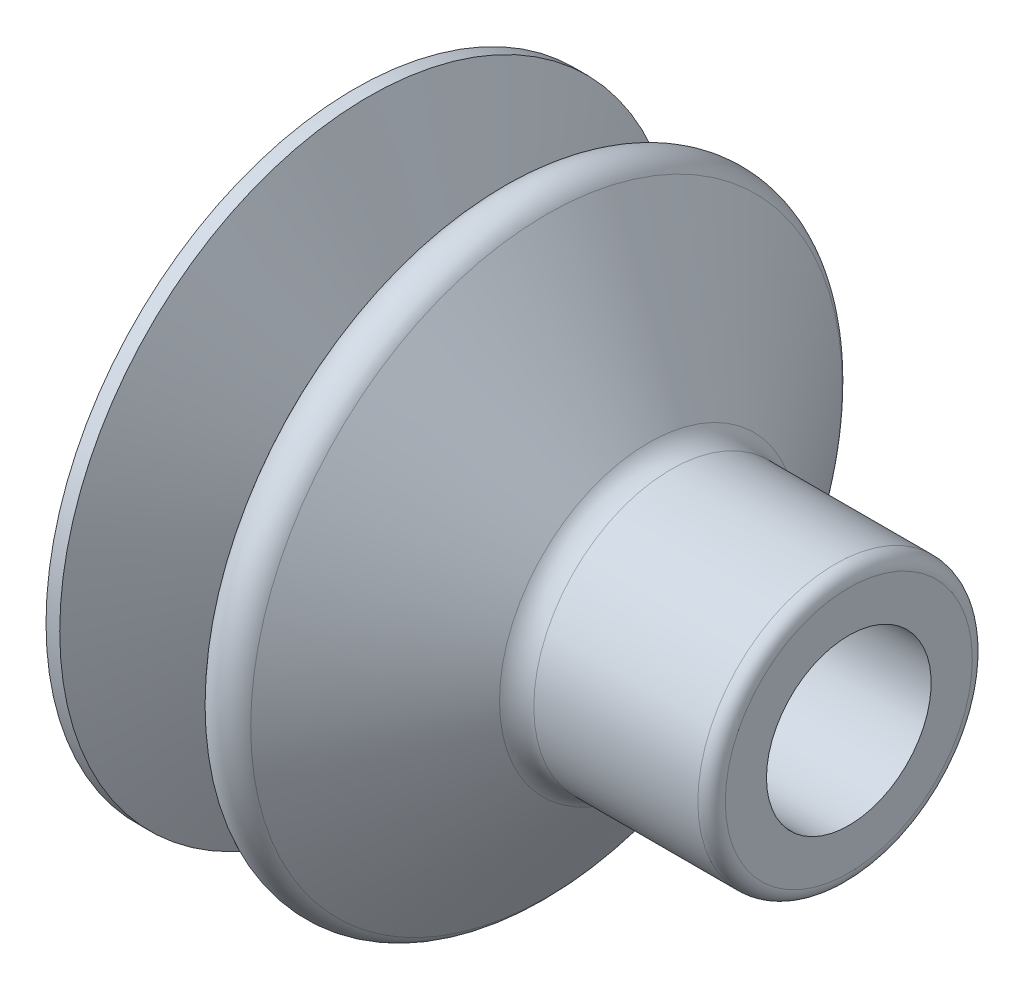
ISO-10303-21;
HEADER;
FILE_DESCRIPTION(('STEP AP214'),'2;1');
FILE_NAME('part.step','',(''),(''),'','','');
FILE_SCHEMA(('AUTOMOTIVE_DESIGN { 1 0 10303 214 1 1 1 1 }'));
ENDSEC;
DATA;
#1=APPLICATION_CONTEXT('core data for automotive mechanical design processes');
#2=APPLICATION_PROTOCOL_DEFINITION('international standard','automotive_design',2000,#1);
#3=PRODUCT_CONTEXT('',#1,'mechanical');
#4=PRODUCT('Part','Part','',(#3));
#5=PRODUCT_RELATED_PRODUCT_CATEGORY('part','',(#4));
#6=PRODUCT_DEFINITION_FORMATION('','',#4);
#7=PRODUCT_DEFINITION_CONTEXT('part definition',#1,'design');
#8=PRODUCT_DEFINITION('design','',#6,#7);
#9=PRODUCT_DEFINITION_SHAPE('','',#8);
#10=(LENGTH_UNIT() NAMED_UNIT(*) SI_UNIT(.MILLI.,.METRE.));
#11=(NAMED_UNIT(*) PLANE_ANGLE_UNIT() SI_UNIT($,.RADIAN.));
#12=(NAMED_UNIT(*) SI_UNIT($,.STERADIAN.) SOLID_ANGLE_UNIT());
#13=UNCERTAINTY_MEASURE_WITH_UNIT(LENGTH_MEASURE(1.E-05),#10,'distance_accuracy_value','');
#14=(GEOMETRIC_REPRESENTATION_CONTEXT(3) GLOBAL_UNCERTAINTY_ASSIGNED_CONTEXT((#13)) GLOBAL_UNIT_ASSIGNED_CONTEXT((#10,
#11,#12)) REPRESENTATION_CONTEXT('',''));
#15=CARTESIAN_POINT('',(0.,0.,0.));
#16=DIRECTION('',(0.,0.,1.));
#17=DIRECTION('',(1.,0.,0.));
#18=AXIS2_PLACEMENT_3D('',#15,#16,#17);
#19=CARTESIAN_POINT('',(3.31701989123151,0.,0.));
#20=DIRECTION('',(1.,0.,0.));
#21=DIRECTION('',(0.,0.,-1.));
#22=AXIS2_PLACEMENT_3D('',#19,#20,#21);
#23=CONICAL_SURFACE('',#22,5.37,1.12788528272126);
#24=CARTESIAN_POINT('',(3.45254607666729,0.,0.));
#25=DIRECTION('',(-1.,0.,0.));
#26=DIRECTION('',(0.,0.,1.));
#27=AXIS2_PLACEMENT_3D('',#24,#25,#26);
#28=CIRCLE('',#27,5.65571428571429);
#29=CARTESIAN_POINT('',(3.45254607666729,0.,5.65571428571429));
#30=VERTEX_POINT('',#29);
#31=EDGE_CURVE('E47',#30,#30,#28,.T.);
#32=ORIENTED_EDGE('',*,*,#31,.T.);
#33=EDGE_LOOP('',(#32));
#34=FACE_BOUND('',#33,.T.);
#35=CARTESIAN_POINT('',(5.76504392155952,0.,0.));
#36=DIRECTION('',(-1.,0.,0.));
#37=DIRECTION('',(0.,0.,1.));
#38=AXIS2_PLACEMENT_3D('',#35,#36,#37);
#39=CIRCLE('',#38,10.5308878017744);
#40=CARTESIAN_POINT('',(5.76504392155952,0.,10.5308878017744));
#41=VERTEX_POINT('',#40);
#42=EDGE_CURVE('E80',#41,#41,#39,.T.);
#43=ORIENTED_EDGE('',*,*,#42,.F.);
#44=EDGE_LOOP('',(#43));
#45=FACE_BOUND('',#44,.T.);
#46=ADVANCED_FACE('F36',(#34,#45),#23,.F.);
#47=CARTESIAN_POINT('',(5.76504392155952,0.,0.));
#48=DIRECTION('',(-1.,0.,0.));
#49=DIRECTION('',(0.,0.,1.));
#50=AXIS2_PLACEMENT_3D('',#47,#48,#49);
#51=CONICAL_SURFACE('',#50,10.5308878017744,0.963345403257555);
#52=CARTESIAN_POINT('',(11.,0.,0.));
#53=DIRECTION('',(-1.,0.,0.));
#54=DIRECTION('',(0.,0.,1.));
#55=AXIS2_PLACEMENT_3D('',#52,#53,#54);
#56=CIRCLE('',#55,3.);
#57=CARTESIAN_POINT('',(11.,0.,3.));
#58=VERTEX_POINT('',#57);
#59=EDGE_CURVE('E83',#58,#58,#56,.T.);
#60=CARTESIAN_POINT('',(11.,0.,3.));
#61=CARTESIAN_POINT('',(10.9454692075162,0.,3.07844674793515));
#62=CARTESIAN_POINT('',(10.8909384150325,0.,3.1568934958703));
#63=CARTESIAN_POINT('',(10.781876830065,0.,3.3137869917406));
#64=CARTESIAN_POINT('',(10.7273460375812,0.,3.39223373967575));
#65=CARTESIAN_POINT('',(10.6182844526137,0.,3.54912723554605));
#66=CARTESIAN_POINT('',(10.56375366013,0.,3.6275739834812));
#67=CARTESIAN_POINT('',(10.4546920751625,0.,3.7844674793515));
#68=CARTESIAN_POINT('',(10.4001612826787,0.,3.86291422728665));
#69=CARTESIAN_POINT('',(10.2910996977112,0.,4.01980772315695));
#70=CARTESIAN_POINT('',(10.2365689052274,0.,4.0982544710921));
#71=CARTESIAN_POINT('',(10.1275073202599,0.,4.2551479669624));
#72=CARTESIAN_POINT('',(10.0729765277762,0.,4.33359471489755));
#73=CARTESIAN_POINT('',(9.96391494280866,0.,4.49048821076785));
#74=CARTESIAN_POINT('',(9.9093841503249,0.,4.568934958703));
#75=CARTESIAN_POINT('',(9.80032256535739,0.,4.7258284545733));
#76=CARTESIAN_POINT('',(9.74579177287364,0.,4.80427520250845));
#77=CARTESIAN_POINT('',(9.63673018790613,0.,4.96116869837876));
#78=CARTESIAN_POINT('',(9.58219939542237,0.,5.03961544631391));
#79=CARTESIAN_POINT('',(9.47313781045486,0.,5.19650894218421));
#80=CARTESIAN_POINT('',(9.41860701797111,0.,5.27495569011936));
#81=CARTESIAN_POINT('',(9.3095454330036,0.,5.43184918598966));
#82=CARTESIAN_POINT('',(9.25501464051984,0.,5.51029593392481));
#83=CARTESIAN_POINT('',(9.14595305555233,0.,5.66718942979511));
#84=CARTESIAN_POINT('',(9.09142226306857,0.,5.74563617773026));
#85=CARTESIAN_POINT('',(8.98236067810106,0.,5.90252967360056));
#86=CARTESIAN_POINT('',(8.92782988561731,0.,5.98097642153571));
#87=CARTESIAN_POINT('',(8.8187683006498,0.,6.13786991740601));
#88=CARTESIAN_POINT('',(8.76423750816605,0.,6.21631666534116));
#89=CARTESIAN_POINT('',(8.65517592319854,0.,6.37321016121146));
#90=CARTESIAN_POINT('',(8.60064513071478,0.,6.45165690914661));
#91=CARTESIAN_POINT('',(8.49158354574727,0.,6.60855040501691));
#92=CARTESIAN_POINT('',(8.43705275326352,0.,6.68699715295206));
#93=CARTESIAN_POINT('',(8.32799116829601,0.,6.84389064882236));
#94=CARTESIAN_POINT('',(8.27346037581225,0.,6.92233739675751));
#95=CARTESIAN_POINT('',(8.16439879084474,0.,7.07923089262781));
#96=CARTESIAN_POINT('',(8.10986799836098,0.,7.15767764056296));
#97=CARTESIAN_POINT('',(8.00080641339347,0.,7.31457113643326));
#98=CARTESIAN_POINT('',(7.94627562090972,0.,7.39301788436841));
#99=CARTESIAN_POINT('',(7.83721403594221,0.,7.54991138023871));
#100=CARTESIAN_POINT('',(7.78268324345845,0.,7.62835812817386));
#101=CARTESIAN_POINT('',(7.67362165849094,0.,7.78525162404417));
#102=CARTESIAN_POINT('',(7.61909086600719,0.,7.86369837197932));
#103=CARTESIAN_POINT('',(7.51002928103968,0.,8.02059186784962));
#104=CARTESIAN_POINT('',(7.45549848855592,0.,8.09903861578477));
#105=CARTESIAN_POINT('',(7.34643690358841,0.,8.25593211165507));
#106=CARTESIAN_POINT('',(7.29190611110466,0.,8.33437885959022));
#107=CARTESIAN_POINT('',(7.18284452613715,0.,8.49127235546052));
#108=CARTESIAN_POINT('',(7.12831373365339,0.,8.56971910339567));
#109=CARTESIAN_POINT('',(7.01925214868588,0.,8.72661259926597));
#110=CARTESIAN_POINT('',(6.96472135620213,0.,8.80505934720112));
#111=CARTESIAN_POINT('',(6.85565977123462,0.,8.96195284307142));
#112=CARTESIAN_POINT('',(6.80112897875086,0.,9.04039959100657));
#113=CARTESIAN_POINT('',(6.69206739378335,0.,9.19729308687687));
#114=CARTESIAN_POINT('',(6.6375366012996,0.,9.27573983481202));
#115=CARTESIAN_POINT('',(6.52847501633209,0.,9.43263333068232));
#116=CARTESIAN_POINT('',(6.47394422384833,0.,9.51108007861747));
#117=CARTESIAN_POINT('',(6.36488263888082,0.,9.66797357448777));
#118=CARTESIAN_POINT('',(6.31035184639707,0.,9.74642032242292));
#119=CARTESIAN_POINT('',(6.20129026142956,0.,9.90331381829322));
#120=CARTESIAN_POINT('',(6.1467594689458,0.,9.98176056622837));
#121=CARTESIAN_POINT('',(6.03769788397829,0.,10.1386540620987));
#122=CARTESIAN_POINT('',(5.98316709149454,0.,10.2171008100338));
#123=CARTESIAN_POINT('',(5.87410550652703,0.,10.3739943059041));
#124=CARTESIAN_POINT('',(5.81957471404327,0.,10.4524410538393));
#125=CARTESIAN_POINT('',(5.76504392155952,0.,10.5308878017744));
#126=B_SPLINE_CURVE_WITH_KNOTS('',3,(#60,#61,#62,#63,#64,#65,#66,#67,#68,#69,#70,#71,#72,#73,
#74,#75,#76,#77,#78,#79,#80,#81,#82,#83,#84,#85,#86,#87,#88,#89,#90,#91,#92,#93,#94,#95,#96,#97,
#98,#99,#100,#101,#102,#103,#104,#105,#106,#107,#108,#109,#110,#111,#112,#113,#114,#115,#116,
#117,#118,#119,#120,#121,#122,#123,#124,#125),.UNSPECIFIED.,.F.,.F.,(4,2,2,2,2,2,2,2,2,2,2,2,2,
2,2,2,2,2,2,2,2,2,2,2,2,2,2,2,2,2,2,2,4),(0.,0.286613845294617,0.573227690589233,
0.859841535883848,1.14645538117846,1.43306922647308,1.7196830717677,2.00629691706231,
2.29291076235693,2.57952460765155,2.86613845294616,3.15275229824078,3.4393661435354,
3.72597998883001,4.01259383412463,4.29920767941925,4.58582152471386,4.87243537000848,
5.1590492153031,5.44566306059771,5.73227690589233,6.01889075118694,6.30550459648156,
6.59211844177618,6.87873228707079,7.16534613236541,7.45195997766003,7.73857382295464,
8.02518766824926,8.31180151354387,8.59841535883849,8.88502920413311,9.17164304942772),.UNSPECIFIED.);
#127=EDGE_CURVE('BSEAM117',#58,#41,#126,.T.);
#128=ORIENTED_EDGE('',*,*,#59,.F.);
#129=ORIENTED_EDGE('',*,*,#42,.T.);
#130=ORIENTED_EDGE('',*,*,#127,.T.);
#131=ORIENTED_EDGE('',*,*,#127,.F.);
#132=EDGE_LOOP('',(#128,#130,#129,#131));
#133=FACE_BOUND('',#132,.T.);
#134=ADVANCED_FACE('F117',(#133),#51,.F.);
#135=CARTESIAN_POINT('',(0.,0.,0.));
#136=DIRECTION('',(-1.,0.,0.));
#137=DIRECTION('',(0.,0.,1.));
#138=AXIS2_PLACEMENT_3D('',#135,#136,#137);
#139=CYLINDRICAL_SURFACE('',#138,3.);
#140=CARTESIAN_POINT('',(18.,0.,0.));
#141=DIRECTION('',(-1.,0.,0.));
#142=DIRECTION('',(0.,0.,1.));
#143=AXIS2_PLACEMENT_3D('',#140,#141,#142);
#144=CIRCLE('',#143,3.);
#145=CARTESIAN_POINT('',(18.,0.,3.));
#146=VERTEX_POINT('',#145);
#147=EDGE_CURVE('E86',#146,#146,#144,.T.);
#148=ORIENTED_EDGE('',*,*,#147,.F.);
#149=EDGE_LOOP('',(#148));
#150=FACE_BOUND('',#149,.T.);
#151=ORIENTED_EDGE('',*,*,#59,.T.);
#152=EDGE_LOOP('',(#151));
#153=FACE_BOUND('',#152,.T.);
#154=ADVANCED_FACE('F123',(#150,#153),#139,.F.);
#155=CARTESIAN_POINT('',(18.,0.,0.));
#156=DIRECTION('',(-1.,0.,0.));
#157=DIRECTION('',(0.,0.,1.));
#158=AXIS2_PLACEMENT_3D('',#155,#156,#157);
#159=PLANE('',#158);
#160=CARTESIAN_POINT('',(18.,0.,0.));
#161=DIRECTION('',(-1.,0.,0.));
#162=DIRECTION('',(0.,0.,1.));
#163=AXIS2_PLACEMENT_3D('',#160,#161,#162);
#164=CIRCLE('',#163,4.5);
#165=CARTESIAN_POINT('',(18.,0.,4.5));
#166=VERTEX_POINT('',#165);
#167=EDGE_CURVE('E10',#166,#166,#164,.F.);
#168=ORIENTED_EDGE('',*,*,#167,.T.);
#169=EDGE_LOOP('',(#168));
#170=FACE_BOUND('',#169,.T.);
#171=ORIENTED_EDGE('',*,*,#147,.T.);
#172=EDGE_LOOP('',(#171));
#173=FACE_BOUND('',#172,.T.);
#174=ADVANCED_FACE('F193',(#170,#173),#159,.F.);
#175=CARTESIAN_POINT('',(0.,0.,0.));
#176=DIRECTION('',(-1.,0.,0.));
#177=DIRECTION('',(0.,0.,1.));
#178=AXIS2_PLACEMENT_3D('',#175,#176,#177);
#179=CYLINDRICAL_SURFACE('',#178,5.);
#180=CARTESIAN_POINT('',(17.5,0.,0.));
#181=DIRECTION('',(-1.,0.,0.));
#182=DIRECTION('',(0.,0.,1.));
#183=AXIS2_PLACEMENT_3D('',#180,#181,#182);
#184=CIRCLE('',#183,5.);
#185=CARTESIAN_POINT('',(17.5,0.,5.));
#186=VERTEX_POINT('',#185);
#187=EDGE_CURVE('E43',#186,#186,#184,.T.);
#188=ORIENTED_EDGE('',*,*,#187,.T.);
#189=EDGE_LOOP('',(#188));
#190=FACE_BOUND('',#189,.T.);
#191=CARTESIAN_POINT('',(11.5227387626277,0.,0.));
#192=DIRECTION('',(-1.,0.,0.));
#193=DIRECTION('',(0.,0.,1.));
#194=AXIS2_PLACEMENT_3D('',#191,#192,#193);
#195=CIRCLE('',#194,5.);
#196=CARTESIAN_POINT('',(11.5227387626277,0.,5.));
#197=VERTEX_POINT('',#196);
#198=EDGE_CURVE('E68',#197,#197,#195,.F.);
#199=ORIENTED_EDGE('',*,*,#198,.T.);
#200=EDGE_LOOP('',(#199));
#201=FACE_BOUND('',#200,.T.);
#202=ADVANCED_FACE('F198',(#190,#201),#179,.T.);
#203=CARTESIAN_POINT('',(11.,0.,0.));
#204=DIRECTION('',(-1.,0.,0.));
#205=DIRECTION('',(0.,0.,1.));
#206=AXIS2_PLACEMENT_3D('',#203,#204,#205);
#207=CONICAL_SURFACE('',#206,5.,0.963345403257555);
#208=CARTESIAN_POINT('',(10.7016331263541,0.,0.));
#209=DIRECTION('',(-1.,0.,0.));
#210=DIRECTION('',(0.,0.,1.));
#211=AXIS2_PLACEMENT_3D('',#208,#209,#210);
#212=CIRCLE('',#211,5.42922374429224);
#213=CARTESIAN_POINT('',(10.7016331263541,0.,5.42922374429224));
#214=VERTEX_POINT('',#213);
#215=EDGE_CURVE('E71',#214,#214,#212,.T.);
#216=ORIENTED_EDGE('',*,*,#215,.T.);
#217=EDGE_LOOP('',(#216));
#218=FACE_BOUND('',#217,.T.);
#219=CARTESIAN_POINT('',(6.98501099659365,0.,0.));
#220=DIRECTION('',(1.,0.,0.));
#221=DIRECTION('',(0.,0.,-1.));
#222=AXIS2_PLACEMENT_3D('',#219,#220,#221);
#223=CIRCLE('',#222,10.7758711356789);
#224=CARTESIAN_POINT('',(6.98501099659365,0.,-10.7758711356789));
#225=VERTEX_POINT('',#224);
#226=EDGE_CURVE('E74',#225,#225,#223,.T.);
#227=ORIENTED_EDGE('',*,*,#226,.T.);
#228=EDGE_LOOP('',(#227));
#229=FACE_BOUND('',#228,.T.);
#230=ADVANCED_FACE('F209',(#218,#229),#207,.T.);
#231=CARTESIAN_POINT('',(6.,0.,0.));
#232=DIRECTION('',(1.,0.,0.));
#233=DIRECTION('',(0.,0.,-1.));
#234=AXIS2_PLACEMENT_3D('',#231,#232,#233);
#235=CONICAL_SURFACE('',#234,12.1928853737565,1.12788528272126);
#236=CARTESIAN_POINT('',(3.45647920075969,0.,0.));
#237=DIRECTION('',(-1.,0.,0.));
#238=DIRECTION('',(0.,0.,1.));
#239=AXIS2_PLACEMENT_3D('',#236,#237,#238);
#240=CIRCLE('',#239,6.83067270601567);
#241=CARTESIAN_POINT('',(3.45647920075969,0.,6.83067270601567));
#242=VERTEX_POINT('',#241);
#243=EDGE_CURVE('E62',#242,#242,#240,.F.);
#244=ORIENTED_EDGE('',*,*,#243,.T.);
#245=EDGE_LOOP('',(#244));
#246=FACE_BOUND('',#245,.T.);
#247=CARTESIAN_POINT('',(5.26039745741482,0.,0.));
#248=DIRECTION('',(-1.,0.,0.));
#249=DIRECTION('',(0.,0.,1.));
#250=AXIS2_PLACEMENT_3D('',#247,#248,#249);
#251=CIRCLE('',#250,10.6336663085426);
#252=CARTESIAN_POINT('',(5.26039745741482,0.,10.6336663085426));
#253=VERTEX_POINT('',#252);
#254=EDGE_CURVE('E77',#253,#253,#251,.T.);
#255=ORIENTED_EDGE('',*,*,#254,.T.);
#256=EDGE_LOOP('',(#255));
#257=FACE_BOUND('',#256,.T.);
#258=ADVANCED_FACE('F224',(#246,#257),#235,.T.);
#259=CARTESIAN_POINT('',(0.5,0.,0.));
#260=DIRECTION('',(-1.,0.,0.));
#261=DIRECTION('',(0.,0.,1.));
#262=AXIS2_PLACEMENT_3D('',#259,#260,#261);
#263=CONICAL_SURFACE('',#262,11.25,1.13591708619965);
#264=CARTESIAN_POINT('',(2.55126478682904,0.,0.));
#265=DIRECTION('',(1.,0.,0.));
#266=DIRECTION('',(0.,0.,-1.));
#267=AXIS2_PLACEMENT_3D('',#264,#265,#266);
#268=CIRCLE('',#267,6.83430797769751);
#269=CARTESIAN_POINT('',(2.55126478682904,0.,-6.83430797769751));
#270=VERTEX_POINT('',#269);
#271=EDGE_CURVE('E65',#270,#270,#268,.F.);
#272=ORIENTED_EDGE('',*,*,#271,.T.);
#273=EDGE_LOOP('',(#272));
#274=FACE_BOUND('',#273,.T.);
#275=CARTESIAN_POINT('',(0.5,0.,0.));
#276=DIRECTION('',(-1.,0.,0.));
#277=DIRECTION('',(0.,0.,1.));
#278=AXIS2_PLACEMENT_3D('',#275,#276,#277);
#279=CIRCLE('',#278,11.25);
#280=CARTESIAN_POINT('',(0.5,0.,11.25));
#281=VERTEX_POINT('',#280);
#282=EDGE_CURVE('E89',#281,#281,#279,.T.);
#283=ORIENTED_EDGE('',*,*,#282,.F.);
#284=EDGE_LOOP('',(#283));
#285=FACE_BOUND('',#284,.T.);
#286=ADVANCED_FACE('F113',(#274,#285),#263,.T.);
#287=CARTESIAN_POINT('',(0.,0.,0.));
#288=DIRECTION('',(-1.,0.,0.));
#289=DIRECTION('',(0.,0.,1.));
#290=AXIS2_PLACEMENT_3D('',#287,#288,#289);
#291=CYLINDRICAL_SURFACE('',#290,11.25);
#292=ORIENTED_EDGE('',*,*,#282,.T.);
#293=EDGE_LOOP('',(#292));
#294=FACE_BOUND('',#293,.T.);
#295=CARTESIAN_POINT('',(0.,0.,0.));
#296=DIRECTION('',(-1.,0.,0.));
#297=DIRECTION('',(0.,0.,1.));
#298=AXIS2_PLACEMENT_3D('',#295,#296,#297);
#299=CIRCLE('',#298,11.25);
#300=CARTESIAN_POINT('',(0.,0.,11.25));
#301=VERTEX_POINT('',#300);
#302=EDGE_CURVE('E92',#301,#301,#299,.T.);
#303=ORIENTED_EDGE('',*,*,#302,.F.);
#304=EDGE_LOOP('',(#303));
#305=FACE_BOUND('',#304,.T.);
#306=ADVANCED_FACE('F103',(#294,#305),#291,.T.);
#307=CARTESIAN_POINT('',(0.,0.,0.));
#308=DIRECTION('',(-1.,0.,0.));
#309=DIRECTION('',(0.,0.,1.));
#310=AXIS2_PLACEMENT_3D('',#307,#308,#309);
#311=PLANE('',#310);
#312=ORIENTED_EDGE('',*,*,#302,.T.);
#313=EDGE_LOOP('',(#312));
#314=FACE_BOUND('',#313,.T.);
#315=CARTESIAN_POINT('',(0.,0.,0.));
#316=DIRECTION('',(-1.,0.,0.));
#317=DIRECTION('',(0.,0.,1.));
#318=AXIS2_PLACEMENT_3D('',#315,#316,#317);
#319=CIRCLE('',#318,11.13953372956);
#320=CARTESIAN_POINT('',(0.,0.,11.13953372956));
#321=VERTEX_POINT('',#320);
#322=EDGE_CURVE('E95',#321,#321,#319,.T.);
#323=ORIENTED_EDGE('',*,*,#322,.F.);
#324=EDGE_LOOP('',(#323));
#325=FACE_BOUND('',#324,.T.);
#326=ADVANCED_FACE('F101',(#314,#325),#311,.T.);
#327=CARTESIAN_POINT('',(0.,0.,0.));
#328=DIRECTION('',(-1.,0.,0.));
#329=DIRECTION('',(0.,0.,1.));
#330=AXIS2_PLACEMENT_3D('',#327,#328,#329);
#331=CONICAL_SURFACE('',#330,11.13953372956,1.13591708619965);
#332=CARTESIAN_POINT('',(2.54576378083452,0.,0.));
#333=DIRECTION('',(1.,0.,0.));
#334=DIRECTION('',(0.,0.,-1.));
#335=AXIS2_PLACEMENT_3D('',#332,#333,#334);
#336=CIRCLE('',#335,5.65934955739613);
#337=CARTESIAN_POINT('',(2.54576378083452,0.,-5.65934955739613));
#338=VERTEX_POINT('',#337);
#339=EDGE_CURVE('E51',#338,#338,#336,.T.);
#340=ORIENTED_EDGE('',*,*,#339,.T.);
#341=EDGE_LOOP('',(#340));
#342=FACE_BOUND('',#341,.T.);
#343=ORIENTED_EDGE('',*,*,#322,.T.);
#344=EDGE_LOOP('',(#343));
#345=FACE_BOUND('',#344,.T.);
#346=ADVANCED_FACE('F99',(#342,#345),#331,.F.);
#347=CARTESIAN_POINT('',(0.,0.,0.));
#348=DIRECTION('',(-1.,0.,0.));
#349=DIRECTION('',(0.,0.,1.));
#350=AXIS2_PLACEMENT_3D('',#347,#348,#349);
#351=CYLINDRICAL_SURFACE('',#350,5.37);
#352=CARTESIAN_POINT('',(2.99922424331255,0.,0.));
#353=DIRECTION('',(1.,0.,0.));
#354=DIRECTION('',(0.,0.,-1.));
#355=AXIS2_PLACEMENT_3D('',#352,#353,#354);
#356=CIRCLE('',#355,5.37);
#357=CARTESIAN_POINT('',(2.99922424331255,0.,-5.37));
#358=VERTEX_POINT('',#357);
#359=EDGE_CURVE('E56',#358,#358,#356,.F.);
#360=ORIENTED_EDGE('',*,*,#359,.T.);
#361=EDGE_LOOP('',(#360));
#362=FACE_BOUND('',#361,.T.);
#363=CARTESIAN_POINT('',(3.00079212521467,0.,0.));
#364=DIRECTION('',(1.,0.,0.));
#365=DIRECTION('',(0.,0.,-1.));
#366=AXIS2_PLACEMENT_3D('',#363,#364,#365);
#367=CIRCLE('',#366,5.37);
#368=CARTESIAN_POINT('',(3.00079212521467,0.,-5.37));
#369=VERTEX_POINT('',#368);
#370=EDGE_CURVE('E59',#369,#369,#367,.T.);
#371=ORIENTED_EDGE('',*,*,#370,.T.);
#372=EDGE_LOOP('',(#371));
#373=FACE_BOUND('',#372,.T.);
#374=ADVANCED_FACE('F110',(#362,#373),#351,.F.);
#375=CARTESIAN_POINT('',(6.16390536032008,0.,0.));
#376=DIRECTION('',(1.,0.,0.));
#377=DIRECTION('',(0.,0.,-1.));
#378=AXIS2_PLACEMENT_3D('',#375,#376,#377);
#379=TOROIDAL_SURFACE('',#378,10.2050948799712,1.);
#380=ORIENTED_EDGE('',*,*,#226,.F.);
#381=EDGE_LOOP('',(#380));
#382=FACE_BOUND('',#381,.T.);
#383=ORIENTED_EDGE('',*,*,#254,.F.);
#384=EDGE_LOOP('',(#383));
#385=FACE_BOUND('',#384,.T.);
#386=ADVANCED_FACE('F129',(#382,#385),#379,.T.);
#387=CARTESIAN_POINT('',(11.5227387626277,0.,0.));
#388=DIRECTION('',(-1.,0.,0.));
#389=DIRECTION('',(0.,0.,1.));
#390=AXIS2_PLACEMENT_3D('',#387,#388,#389);
#391=TOROIDAL_SURFACE('',#390,6.,1.);
#392=ORIENTED_EDGE('',*,*,#198,.F.);
#393=EDGE_LOOP('',(#392));
#394=FACE_BOUND('',#393,.T.);
#395=ORIENTED_EDGE('',*,*,#215,.F.);
#396=EDGE_LOOP('',(#395));
#397=FACE_BOUND('',#396,.T.);
#398=ADVANCED_FACE('F132',(#394,#397),#391,.F.);
#399=CARTESIAN_POINT('',(3.00472524930707,0.,0.));
#400=DIRECTION('',(-1.,0.,0.));
#401=DIRECTION('',(0.,0.,1.));
#402=AXIS2_PLACEMENT_3D('',#399,#400,#401);
#403=TOROIDAL_SURFACE('',#402,7.04495842030138,0.5);
#404=ORIENTED_EDGE('',*,*,#243,.F.);
#405=EDGE_LOOP('',(#404));
#406=FACE_BOUND('',#405,.T.);
#407=ORIENTED_EDGE('',*,*,#271,.F.);
#408=EDGE_LOOP('',(#407));
#409=FACE_BOUND('',#408,.T.);
#410=ADVANCED_FACE('F136',(#406,#409),#403,.F.);
#411=CARTESIAN_POINT('',(2.99922424331255,0.,0.));
#412=DIRECTION('',(1.,0.,0.));
#413=DIRECTION('',(0.,0.,-1.));
#414=AXIS2_PLACEMENT_3D('',#411,#412,#413);
#415=TOROIDAL_SURFACE('',#414,5.87,0.5);
#416=ORIENTED_EDGE('',*,*,#339,.F.);
#417=EDGE_LOOP('',(#416));
#418=FACE_BOUND('',#417,.T.);
#419=ORIENTED_EDGE('',*,*,#359,.F.);
#420=EDGE_LOOP('',(#419));
#421=FACE_BOUND('',#420,.T.);
#422=ADVANCED_FACE('F140',(#418,#421),#415,.T.);
#423=CARTESIAN_POINT('',(3.00079212521467,0.,0.));
#424=DIRECTION('',(1.,0.,0.));
#425=DIRECTION('',(0.,0.,-1.));
#426=AXIS2_PLACEMENT_3D('',#423,#424,#425);
#427=TOROIDAL_SURFACE('',#426,5.87,0.5);
#428=ORIENTED_EDGE('',*,*,#370,.F.);
#429=EDGE_LOOP('',(#428));
#430=FACE_BOUND('',#429,.T.);
#431=ORIENTED_EDGE('',*,*,#31,.F.);
#432=EDGE_LOOP('',(#431));
#433=FACE_BOUND('',#432,.T.);
#434=ADVANCED_FACE('F143',(#430,#433),#427,.T.);
#435=CARTESIAN_POINT('',(17.5,0.,0.));
#436=DIRECTION('',(-1.,0.,0.));
#437=DIRECTION('',(0.,0.,1.));
#438=AXIS2_PLACEMENT_3D('',#435,#436,#437);
#439=TOROIDAL_SURFACE('',#438,4.5,0.5);
#440=ORIENTED_EDGE('',*,*,#167,.F.);
#441=EDGE_LOOP('',(#440));
#442=FACE_BOUND('',#441,.T.);
#443=ORIENTED_EDGE('',*,*,#187,.F.);
#444=EDGE_LOOP('',(#443));
#445=FACE_BOUND('',#444,.T.);
#446=ADVANCED_FACE('F38',(#442,#445),#439,.T.);
#447=CLOSED_SHELL('',(#46,#134,#154,#174,#202,#230,#258,#286,#306,#326,#346,#374,#386,#398,#410,
#422,#434,#446));
#448=MANIFOLD_SOLID_BREP('B2',#447);
#449=ADVANCED_BREP_SHAPE_REPRESENTATION('',(#18,#448),#14);
#450=SHAPE_DEFINITION_REPRESENTATION(#9,#449);
ENDSEC;
END-ISO-10303-21;
